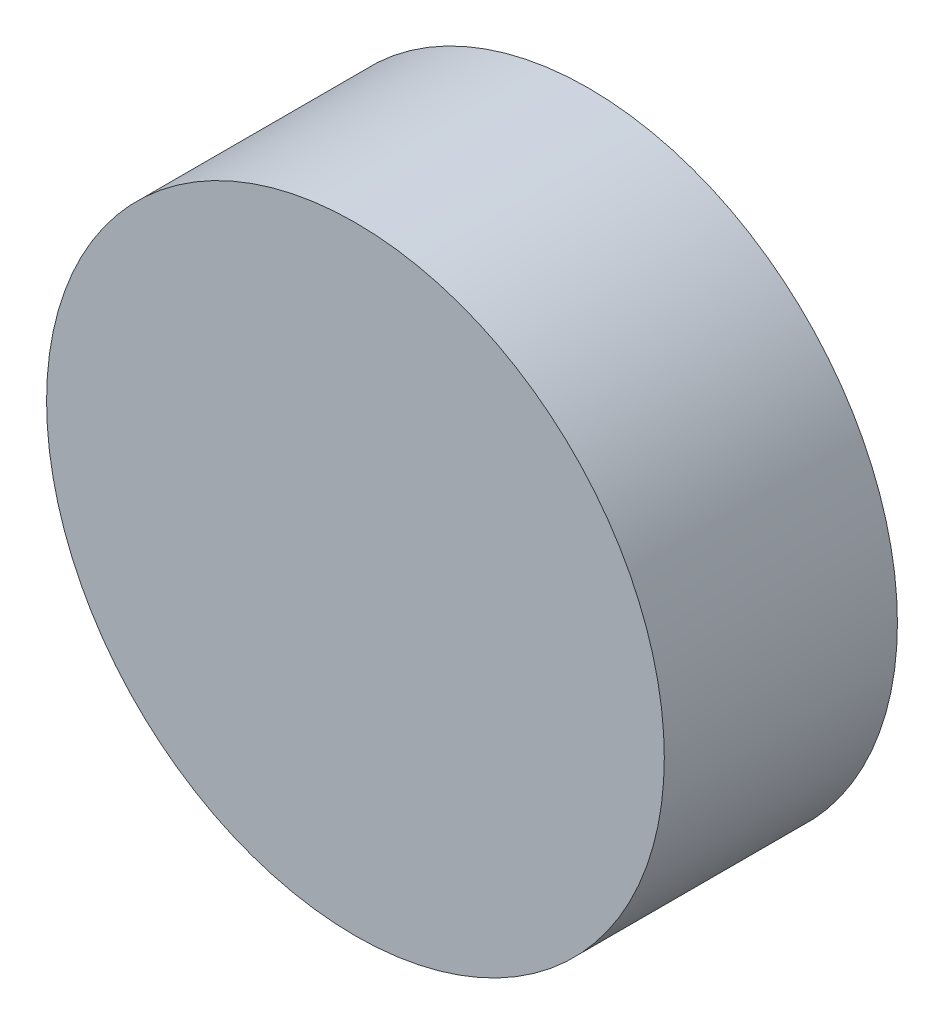
ISO-10303-21;
HEADER;
FILE_DESCRIPTION(('STEP AP214'),'2;1');
FILE_NAME('part.step','',(''),(''),'','','');
FILE_SCHEMA(('AUTOMOTIVE_DESIGN { 1 0 10303 214 1 1 1 1 }'));
ENDSEC;
DATA;
#1=APPLICATION_CONTEXT('core data for automotive mechanical design processes');
#2=APPLICATION_PROTOCOL_DEFINITION('international standard','automotive_design',2000,#1);
#3=PRODUCT_CONTEXT('',#1,'mechanical');
#4=PRODUCT('Part','Part','',(#3));
#5=PRODUCT_RELATED_PRODUCT_CATEGORY('part','',(#4));
#6=PRODUCT_DEFINITION_FORMATION('','',#4);
#7=PRODUCT_DEFINITION_CONTEXT('part definition',#1,'design');
#8=PRODUCT_DEFINITION('design','',#6,#7);
#9=PRODUCT_DEFINITION_SHAPE('','',#8);
#10=(LENGTH_UNIT() NAMED_UNIT(*) SI_UNIT(.MILLI.,.METRE.));
#11=(NAMED_UNIT(*) PLANE_ANGLE_UNIT() SI_UNIT($,.RADIAN.));
#12=(NAMED_UNIT(*) SI_UNIT($,.STERADIAN.) SOLID_ANGLE_UNIT());
#13=UNCERTAINTY_MEASURE_WITH_UNIT(LENGTH_MEASURE(1.E-05),#10,'distance_accuracy_value','');
#14=(GEOMETRIC_REPRESENTATION_CONTEXT(3) GLOBAL_UNCERTAINTY_ASSIGNED_CONTEXT((#13)) GLOBAL_UNIT_ASSIGNED_CONTEXT((#10,
#11,#12)) REPRESENTATION_CONTEXT('',''));
#15=CARTESIAN_POINT('',(0.,0.,0.));
#16=DIRECTION('',(0.,0.,1.));
#17=DIRECTION('',(1.,0.,0.));
#18=AXIS2_PLACEMENT_3D('',#15,#16,#17);
#19=CARTESIAN_POINT('',(0.,0.,20.));
#20=DIRECTION('',(0.,0.,-1.));
#21=DIRECTION('',(-1.,0.,0.));
#22=AXIS2_PLACEMENT_3D('',#19,#20,#21);
#23=CYLINDRICAL_SURFACE('',#22,26.5);
#24=CARTESIAN_POINT('',(0.,0.,20.));
#25=DIRECTION('',(0.,0.,1.));
#26=DIRECTION('',(1.,0.,0.));
#27=AXIS2_PLACEMENT_3D('',#24,#25,#26);
#28=CIRCLE('',#27,26.5);
#29=CARTESIAN_POINT('',(26.5,0.,20.));
#30=VERTEX_POINT('',#29);
#31=EDGE_CURVE('E10',#30,#30,#28,.T.);
#32=ORIENTED_EDGE('',*,*,#31,.F.);
#33=EDGE_LOOP('',(#32));
#34=FACE_BOUND('',#33,.T.);
#35=CARTESIAN_POINT('',(0.,0.,0.));
#36=DIRECTION('',(0.,0.,1.));
#37=DIRECTION('',(1.,0.,0.));
#38=AXIS2_PLACEMENT_3D('',#35,#36,#37);
#39=CIRCLE('',#38,26.5);
#40=CARTESIAN_POINT('',(26.5,0.,0.));
#41=VERTEX_POINT('',#40);
#42=EDGE_CURVE('E46',#41,#41,#39,.T.);
#43=ORIENTED_EDGE('',*,*,#42,.T.);
#44=EDGE_LOOP('',(#43));
#45=FACE_BOUND('',#44,.T.);
#46=ADVANCED_FACE('F43',(#34,#45),#23,.T.);
#47=CARTESIAN_POINT('',(0.,0.,20.));
#48=DIRECTION('',(0.,0.,1.));
#49=DIRECTION('',(1.,0.,0.));
#50=AXIS2_PLACEMENT_3D('',#47,#48,#49);
#51=PLANE('',#50);
#52=ORIENTED_EDGE('',*,*,#31,.T.);
#53=EDGE_LOOP('',(#52));
#54=FACE_BOUND('',#53,.T.);
#55=ADVANCED_FACE('F60',(#54),#51,.T.);
#56=CARTESIAN_POINT('',(0.,0.,0.));
#57=DIRECTION('',(0.,0.,1.));
#58=DIRECTION('',(1.,0.,0.));
#59=AXIS2_PLACEMENT_3D('',#56,#57,#58);
#60=PLANE('',#59);
#61=ORIENTED_EDGE('',*,*,#42,.F.);
#62=EDGE_LOOP('',(#61));
#63=FACE_BOUND('',#62,.T.);
#64=ADVANCED_FACE('F58',(#63),#60,.F.);
#65=CLOSED_SHELL('',(#46,#55,#64));
#66=MANIFOLD_SOLID_BREP('B2',#65);
#67=ADVANCED_BREP_SHAPE_REPRESENTATION('',(#18,#66),#14);
#68=SHAPE_DEFINITION_REPRESENTATION(#9,#67);
ENDSEC;
END-ISO-10303-21;
